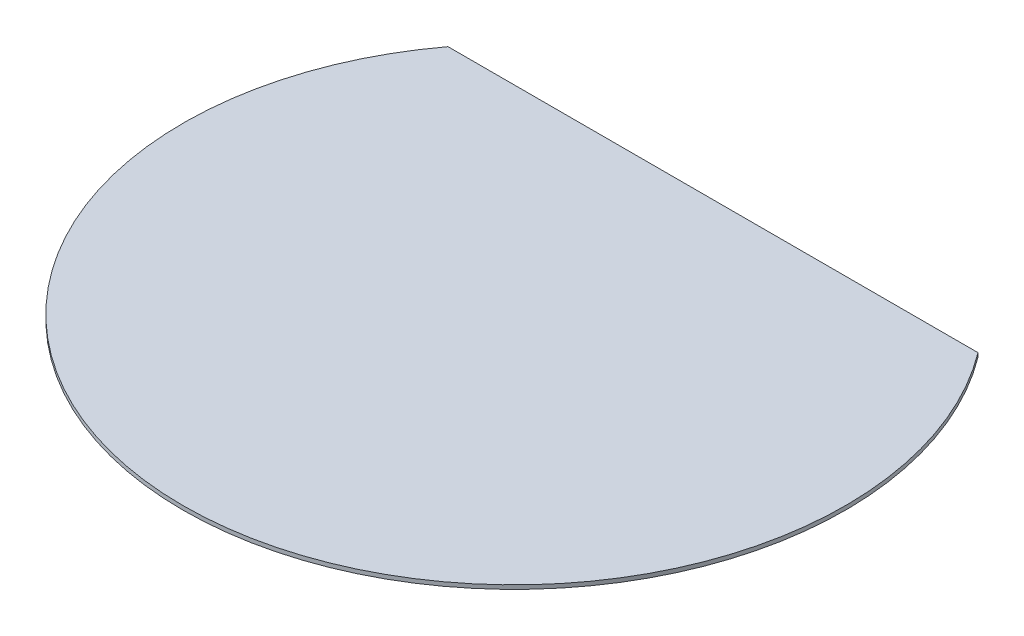
ISO-10303-21;
HEADER;
FILE_DESCRIPTION(('STEP AP214'),'2;1');
FILE_NAME('part.step','',(''),(''),'','','');
FILE_SCHEMA(('AUTOMOTIVE_DESIGN { 1 0 10303 214 1 1 1 1 }'));
ENDSEC;
DATA;
#1=APPLICATION_CONTEXT('core data for automotive mechanical design processes');
#2=APPLICATION_PROTOCOL_DEFINITION('international standard','automotive_design',2000,#1);
#3=PRODUCT_CONTEXT('',#1,'mechanical');
#4=PRODUCT('Part','Part','',(#3));
#5=PRODUCT_RELATED_PRODUCT_CATEGORY('part','',(#4));
#6=PRODUCT_DEFINITION_FORMATION('','',#4);
#7=PRODUCT_DEFINITION_CONTEXT('part definition',#1,'design');
#8=PRODUCT_DEFINITION('design','',#6,#7);
#9=PRODUCT_DEFINITION_SHAPE('','',#8);
#10=(LENGTH_UNIT() NAMED_UNIT(*) SI_UNIT(.MILLI.,.METRE.));
#11=(NAMED_UNIT(*) PLANE_ANGLE_UNIT() SI_UNIT($,.RADIAN.));
#12=(NAMED_UNIT(*) SI_UNIT($,.STERADIAN.) SOLID_ANGLE_UNIT());
#13=UNCERTAINTY_MEASURE_WITH_UNIT(LENGTH_MEASURE(1.E-05),#10,'distance_accuracy_value','');
#14=(GEOMETRIC_REPRESENTATION_CONTEXT(3) GLOBAL_UNCERTAINTY_ASSIGNED_CONTEXT((#13)) GLOBAL_UNIT_ASSIGNED_CONTEXT((#10,
#11,#12)) REPRESENTATION_CONTEXT('',''));
#15=CARTESIAN_POINT('',(0.,0.,0.));
#16=DIRECTION('',(0.,0.,1.));
#17=DIRECTION('',(1.,0.,0.));
#18=AXIS2_PLACEMENT_3D('',#15,#16,#17);
#19=CARTESIAN_POINT('',(0.,12.7,0.));
#20=DIRECTION('',(0.,-1.,0.));
#21=DIRECTION('',(0.,0.,-1.));
#22=AXIS2_PLACEMENT_3D('',#19,#20,#21);
#23=CYLINDRICAL_SURFACE('',#22,1060.45);
#24=CARTESIAN_POINT('',(0.,0.,0.));
#25=DIRECTION('',(0.,1.,0.));
#26=DIRECTION('',(0.,0.,1.));
#27=AXIS2_PLACEMENT_3D('',#24,#25,#26);
#28=CIRCLE('',#27,1060.45);
#29=CARTESIAN_POINT('',(-848.36,0.,-636.27));
#30=VERTEX_POINT('',#29);
#31=CARTESIAN_POINT('',(848.36,0.,-636.27));
#32=VERTEX_POINT('',#31);
#33=EDGE_CURVE('E70',#30,#32,#28,.T.);
#34=ORIENTED_EDGE('',*,*,#33,.T.);
#35=DIRECTION('',(0.,-1.,0.));
#36=VECTOR('',#35,1.);
#37=CARTESIAN_POINT('',(848.36,12.7,-636.27));
#38=LINE('',#37,#36);
#39=CARTESIAN_POINT('',(848.36,12.7,-636.27));
#40=VERTEX_POINT('',#39);
#41=EDGE_CURVE('E11',#40,#32,#38,.T.);
#42=ORIENTED_EDGE('',*,*,#41,.F.);
#43=CARTESIAN_POINT('',(0.,12.7,0.));
#44=DIRECTION('',(0.,1.,0.));
#45=DIRECTION('',(0.,0.,1.));
#46=AXIS2_PLACEMENT_3D('',#43,#44,#45);
#47=CIRCLE('',#46,1060.45);
#48=CARTESIAN_POINT('',(-848.36,12.7,-636.27));
#49=VERTEX_POINT('',#48);
#50=EDGE_CURVE('E69',#49,#40,#47,.T.);
#51=ORIENTED_EDGE('',*,*,#50,.F.);
#52=DIRECTION('',(0.,-1.,0.));
#53=VECTOR('',#52,1.);
#54=CARTESIAN_POINT('',(-848.36,12.7,-636.27));
#55=LINE('',#54,#53);
#56=EDGE_CURVE('E47',#49,#30,#55,.T.);
#57=ORIENTED_EDGE('',*,*,#56,.T.);
#58=EDGE_LOOP('',(#34,#42,#51,#57));
#59=FACE_BOUND('',#58,.T.);
#60=ADVANCED_FACE('F39',(#59),#23,.T.);
#61=CARTESIAN_POINT('',(-848.36,12.7,-636.27));
#62=DIRECTION('',(0.,0.,1.));
#63=DIRECTION('',(1.,0.,0.));
#64=AXIS2_PLACEMENT_3D('',#61,#62,#63);
#65=PLANE('',#64);
#66=DIRECTION('',(-1.,0.,0.));
#67=VECTOR('',#66,1.);
#68=CARTESIAN_POINT('',(-848.36,0.,-636.27));
#69=LINE('',#68,#67);
#70=EDGE_CURVE('E62',#32,#30,#69,.T.);
#71=ORIENTED_EDGE('',*,*,#70,.T.);
#72=ORIENTED_EDGE('',*,*,#56,.F.);
#73=DIRECTION('',(-1.,0.,0.));
#74=VECTOR('',#73,1.);
#75=CARTESIAN_POINT('',(-848.36,12.7,-636.27));
#76=LINE('',#75,#74);
#77=EDGE_CURVE('E54',#40,#49,#76,.T.);
#78=ORIENTED_EDGE('',*,*,#77,.F.);
#79=ORIENTED_EDGE('',*,*,#41,.T.);
#80=EDGE_LOOP('',(#71,#72,#78,#79));
#81=FACE_BOUND('',#80,.T.);
#82=ADVANCED_FACE('F65',(#81),#65,.F.);
#83=CARTESIAN_POINT('',(0.,12.7,0.));
#84=DIRECTION('',(0.,1.,0.));
#85=DIRECTION('',(0.,0.,1.));
#86=AXIS2_PLACEMENT_3D('',#83,#84,#85);
#87=PLANE('',#86);
#88=ORIENTED_EDGE('',*,*,#50,.T.);
#89=ORIENTED_EDGE('',*,*,#77,.T.);
#90=EDGE_LOOP('',(#88,#89));
#91=FACE_BOUND('',#90,.T.);
#92=ADVANCED_FACE('F77',(#91),#87,.T.);
#93=CARTESIAN_POINT('',(0.,0.,0.));
#94=DIRECTION('',(0.,1.,0.));
#95=DIRECTION('',(0.,0.,1.));
#96=AXIS2_PLACEMENT_3D('',#93,#94,#95);
#97=PLANE('',#96);
#98=ORIENTED_EDGE('',*,*,#33,.F.);
#99=ORIENTED_EDGE('',*,*,#70,.F.);
#100=EDGE_LOOP('',(#98,#99));
#101=FACE_BOUND('',#100,.T.);
#102=ADVANCED_FACE('F73',(#101),#97,.F.);
#103=CLOSED_SHELL('',(#60,#82,#92,#102));
#104=MANIFOLD_SOLID_BREP('B2',#103);
#105=ADVANCED_BREP_SHAPE_REPRESENTATION('',(#18,#104),#14);
#106=SHAPE_DEFINITION_REPRESENTATION(#9,#105);
ENDSEC;
END-ISO-10303-21;
